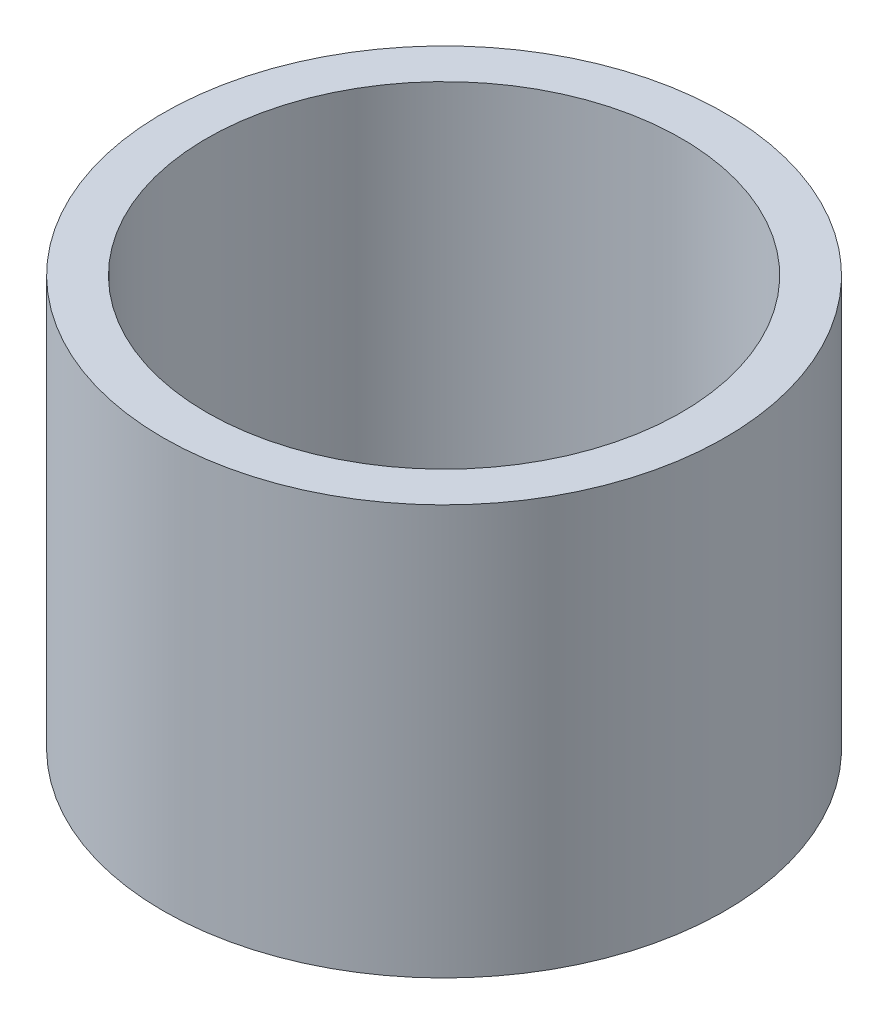
ISO-10303-21;
HEADER;
FILE_DESCRIPTION(('STEP AP214'),'2;1');
FILE_NAME('part.step','',(''),(''),'','','');
FILE_SCHEMA(('AUTOMOTIVE_DESIGN { 1 0 10303 214 1 1 1 1 }'));
ENDSEC;
DATA;
#1=APPLICATION_CONTEXT('core data for automotive mechanical design processes');
#2=APPLICATION_PROTOCOL_DEFINITION('international standard','automotive_design',2000,#1);
#3=PRODUCT_CONTEXT('',#1,'mechanical');
#4=PRODUCT('Part','Part','',(#3));
#5=PRODUCT_RELATED_PRODUCT_CATEGORY('part','',(#4));
#6=PRODUCT_DEFINITION_FORMATION('','',#4);
#7=PRODUCT_DEFINITION_CONTEXT('part definition',#1,'design');
#8=PRODUCT_DEFINITION('design','',#6,#7);
#9=PRODUCT_DEFINITION_SHAPE('','',#8);
#10=(LENGTH_UNIT() NAMED_UNIT(*) SI_UNIT(.MILLI.,.METRE.));
#11=(NAMED_UNIT(*) PLANE_ANGLE_UNIT() SI_UNIT($,.RADIAN.));
#12=(NAMED_UNIT(*) SI_UNIT($,.STERADIAN.) SOLID_ANGLE_UNIT());
#13=UNCERTAINTY_MEASURE_WITH_UNIT(LENGTH_MEASURE(1.E-05),#10,'distance_accuracy_value','');
#14=(GEOMETRIC_REPRESENTATION_CONTEXT(3) GLOBAL_UNCERTAINTY_ASSIGNED_CONTEXT((#13)) GLOBAL_UNIT_ASSIGNED_CONTEXT((#10,
#11,#12)) REPRESENTATION_CONTEXT('',''));
#15=CARTESIAN_POINT('',(0.,0.,0.));
#16=DIRECTION('',(0.,0.,1.));
#17=DIRECTION('',(1.,0.,0.));
#18=AXIS2_PLACEMENT_3D('',#15,#16,#17);
#19=CARTESIAN_POINT('',(0.,41.656,0.));
#20=DIRECTION('',(0.,-1.,0.));
#21=DIRECTION('',(0.,0.,-1.));
#22=AXIS2_PLACEMENT_3D('',#19,#20,#21);
#23=CYLINDRICAL_SURFACE('',#22,28.575);
#24=CARTESIAN_POINT('',(0.,41.656,0.));
#25=DIRECTION('',(0.,1.,0.));
#26=DIRECTION('',(0.,0.,1.));
#27=AXIS2_PLACEMENT_3D('',#24,#25,#26);
#28=CIRCLE('',#27,28.575);
#29=CARTESIAN_POINT('',(0.,41.656,28.575));
#30=VERTEX_POINT('',#29);
#31=EDGE_CURVE('E10',#30,#30,#28,.T.);
#32=ORIENTED_EDGE('',*,*,#31,.F.);
#33=EDGE_LOOP('',(#32));
#34=FACE_BOUND('',#33,.T.);
#35=CARTESIAN_POINT('',(0.,0.,0.));
#36=DIRECTION('',(0.,1.,0.));
#37=DIRECTION('',(0.,0.,1.));
#38=AXIS2_PLACEMENT_3D('',#35,#36,#37);
#39=CIRCLE('',#38,28.575);
#40=CARTESIAN_POINT('',(0.,0.,28.575));
#41=VERTEX_POINT('',#40);
#42=EDGE_CURVE('E34',#41,#41,#39,.T.);
#43=ORIENTED_EDGE('',*,*,#42,.T.);
#44=EDGE_LOOP('',(#43));
#45=FACE_BOUND('',#44,.T.);
#46=ADVANCED_FACE('F31',(#34,#45),#23,.T.);
#47=CARTESIAN_POINT('',(0.,41.656,0.));
#48=DIRECTION('',(0.,1.,0.));
#49=DIRECTION('',(0.,0.,1.));
#50=AXIS2_PLACEMENT_3D('',#47,#48,#49);
#51=PLANE('',#50);
#52=CARTESIAN_POINT('',(0.,41.656,0.));
#53=DIRECTION('',(0.,1.,0.));
#54=DIRECTION('',(0.,0.,1.));
#55=AXIS2_PLACEMENT_3D('',#52,#53,#54);
#56=CIRCLE('',#55,24.13);
#57=CARTESIAN_POINT('',(0.,41.656,24.13));
#58=VERTEX_POINT('',#57);
#59=EDGE_CURVE('E43',#58,#58,#56,.T.);
#60=ORIENTED_EDGE('',*,*,#59,.F.);
#61=EDGE_LOOP('',(#60));
#62=FACE_BOUND('',#61,.T.);
#63=ORIENTED_EDGE('',*,*,#31,.T.);
#64=EDGE_LOOP('',(#63));
#65=FACE_BOUND('',#64,.T.);
#66=ADVANCED_FACE('F58',(#62,#65),#51,.T.);
#67=CARTESIAN_POINT('',(0.,0.,0.));
#68=DIRECTION('',(0.,1.,0.));
#69=DIRECTION('',(0.,0.,1.));
#70=AXIS2_PLACEMENT_3D('',#67,#68,#69);
#71=PLANE('',#70);
#72=ORIENTED_EDGE('',*,*,#42,.F.);
#73=EDGE_LOOP('',(#72));
#74=FACE_BOUND('',#73,.T.);
#75=ADVANCED_FACE('F54',(#74),#71,.F.);
#76=CARTESIAN_POINT('',(0.,6.39064,0.));
#77=DIRECTION('',(0.,1.,0.));
#78=DIRECTION('',(0.,0.,1.));
#79=AXIS2_PLACEMENT_3D('',#76,#77,#78);
#80=CYLINDRICAL_SURFACE('',#79,24.13);
#81=CARTESIAN_POINT('',(0.,6.39064,0.));
#82=DIRECTION('',(0.,1.,0.));
#83=DIRECTION('',(0.,0.,1.));
#84=AXIS2_PLACEMENT_3D('',#81,#82,#83);
#85=CIRCLE('',#84,24.13);
#86=CARTESIAN_POINT('',(0.,6.39064,24.13));
#87=VERTEX_POINT('',#86);
#88=EDGE_CURVE('E41',#87,#87,#85,.T.);
#89=ORIENTED_EDGE('',*,*,#88,.F.);
#90=EDGE_LOOP('',(#89));
#91=FACE_BOUND('',#90,.T.);
#92=ORIENTED_EDGE('',*,*,#59,.T.);
#93=EDGE_LOOP('',(#92));
#94=FACE_BOUND('',#93,.T.);
#95=ADVANCED_FACE('F51',(#91,#94),#80,.F.);
#96=CARTESIAN_POINT('',(0.,6.39064,0.));
#97=DIRECTION('',(0.,1.,0.));
#98=DIRECTION('',(0.,0.,1.));
#99=AXIS2_PLACEMENT_3D('',#96,#97,#98);
#100=PLANE('',#99);
#101=ORIENTED_EDGE('',*,*,#88,.T.);
#102=EDGE_LOOP('',(#101));
#103=FACE_BOUND('',#102,.T.);
#104=ADVANCED_FACE('F49',(#103),#100,.T.);
#105=CLOSED_SHELL('',(#46,#66,#75,#95,#104));
#106=MANIFOLD_SOLID_BREP('B2',#105);
#107=ADVANCED_BREP_SHAPE_REPRESENTATION('',(#18,#106),#14);
#108=SHAPE_DEFINITION_REPRESENTATION(#9,#107);
ENDSEC;
END-ISO-10303-21;
